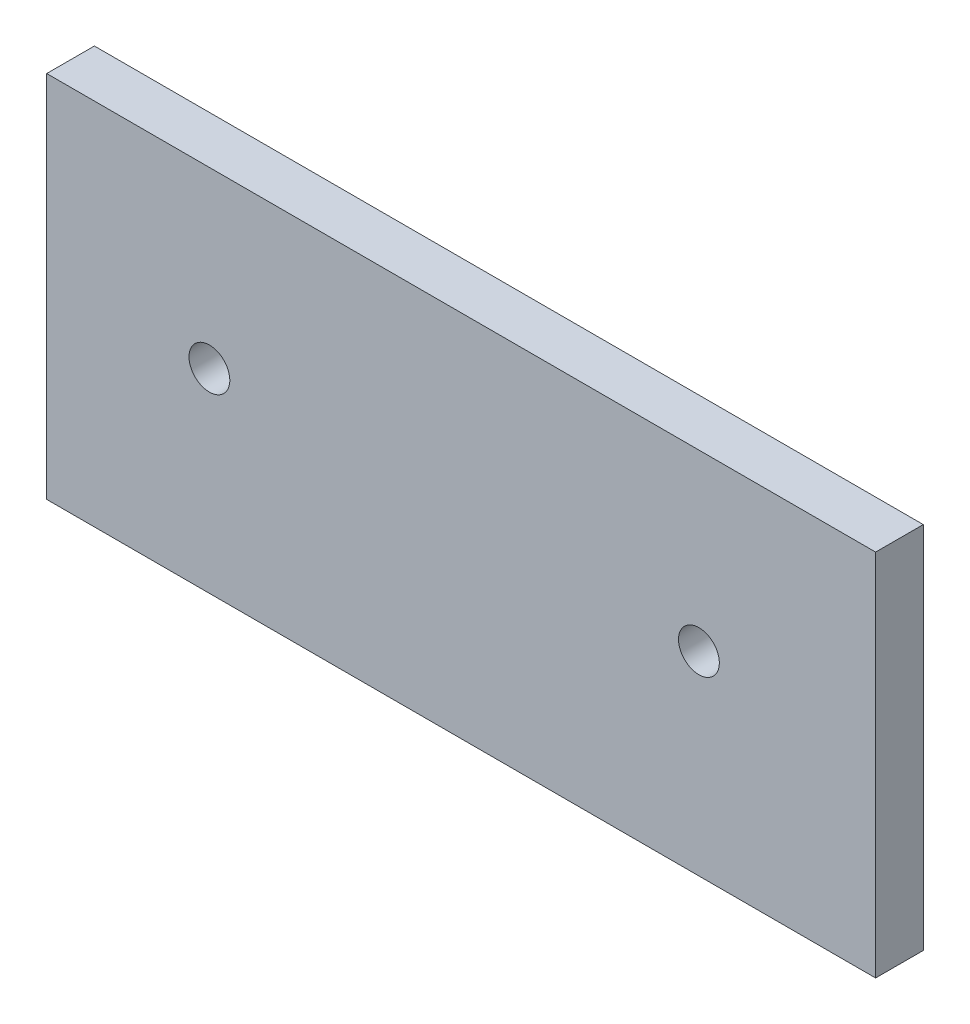
ISO-10303-21;
HEADER;
FILE_DESCRIPTION(('STEP AP214'),'2;1');
FILE_NAME('part.step','',(''),(''),'','','');
FILE_SCHEMA(('AUTOMOTIVE_DESIGN { 1 0 10303 214 1 1 1 1 }'));
ENDSEC;
DATA;
#1=APPLICATION_CONTEXT('core data for automotive mechanical design processes');
#2=APPLICATION_PROTOCOL_DEFINITION('international standard','automotive_design',2000,#1);
#3=PRODUCT_CONTEXT('',#1,'mechanical');
#4=PRODUCT('Part','Part','',(#3));
#5=PRODUCT_RELATED_PRODUCT_CATEGORY('part','',(#4));
#6=PRODUCT_DEFINITION_FORMATION('','',#4);
#7=PRODUCT_DEFINITION_CONTEXT('part definition',#1,'design');
#8=PRODUCT_DEFINITION('design','',#6,#7);
#9=PRODUCT_DEFINITION_SHAPE('','',#8);
#10=(LENGTH_UNIT() NAMED_UNIT(*) SI_UNIT(.MILLI.,.METRE.));
#11=(NAMED_UNIT(*) PLANE_ANGLE_UNIT() SI_UNIT($,.RADIAN.));
#12=(NAMED_UNIT(*) SI_UNIT($,.STERADIAN.) SOLID_ANGLE_UNIT());
#13=UNCERTAINTY_MEASURE_WITH_UNIT(LENGTH_MEASURE(1.E-05),#10,'distance_accuracy_value','');
#14=(GEOMETRIC_REPRESENTATION_CONTEXT(3) GLOBAL_UNCERTAINTY_ASSIGNED_CONTEXT((#13)) GLOBAL_UNIT_ASSIGNED_CONTEXT((#10,
#11,#12)) REPRESENTATION_CONTEXT('',''));
#15=CARTESIAN_POINT('',(0.,0.,0.));
#16=DIRECTION('',(0.,0.,1.));
#17=DIRECTION('',(1.,0.,0.));
#18=AXIS2_PLACEMENT_3D('',#15,#16,#17);
#19=CARTESIAN_POINT('',(-101.6,0.,5.842));
#20=DIRECTION('',(1.,0.,0.));
#21=DIRECTION('',(0.,0.,-1.));
#22=AXIS2_PLACEMENT_3D('',#19,#20,#21);
#23=PLANE('',#22);
#24=DIRECTION('',(0.,-1.,0.));
#25=VECTOR('',#24,1.);
#26=CARTESIAN_POINT('',(-101.6,0.,0.));
#27=LINE('',#26,#25);
#28=CARTESIAN_POINT('',(-101.6,45.212,0.));
#29=VERTEX_POINT('',#28);
#30=CARTESIAN_POINT('',(-101.6,0.,0.));
#31=VERTEX_POINT('',#30);
#32=EDGE_CURVE('E96',#29,#31,#27,.T.);
#33=ORIENTED_EDGE('',*,*,#32,.T.);
#34=DIRECTION('',(0.,0.,-1.));
#35=VECTOR('',#34,1.);
#36=CARTESIAN_POINT('',(-101.6,0.,5.842));
#37=LINE('',#36,#35);
#38=CARTESIAN_POINT('',(-101.6,0.,5.842));
#39=VERTEX_POINT('',#38);
#40=EDGE_CURVE('E11',#39,#31,#37,.T.);
#41=ORIENTED_EDGE('',*,*,#40,.F.);
#42=DIRECTION('',(0.,-1.,0.));
#43=VECTOR('',#42,1.);
#44=CARTESIAN_POINT('',(-101.6,0.,5.842));
#45=LINE('',#44,#43);
#46=CARTESIAN_POINT('',(-101.6,45.212,5.842));
#47=VERTEX_POINT('',#46);
#48=EDGE_CURVE('E84',#47,#39,#45,.T.);
#49=ORIENTED_EDGE('',*,*,#48,.F.);
#50=DIRECTION('',(0.,0.,-1.));
#51=VECTOR('',#50,1.);
#52=CARTESIAN_POINT('',(-101.6,45.212,5.842));
#53=LINE('',#52,#51);
#54=EDGE_CURVE('E92',#47,#29,#53,.T.);
#55=ORIENTED_EDGE('',*,*,#54,.T.);
#56=EDGE_LOOP('',(#33,#41,#49,#55));
#57=FACE_BOUND('',#56,.T.);
#58=ADVANCED_FACE('F33',(#57),#23,.F.);
#59=CARTESIAN_POINT('',(-101.6,0.,5.842));
#60=DIRECTION('',(0.,1.,0.));
#61=DIRECTION('',(0.,0.,1.));
#62=AXIS2_PLACEMENT_3D('',#59,#60,#61);
#63=PLANE('',#62);
#64=DIRECTION('',(1.,0.,0.));
#65=VECTOR('',#64,1.);
#66=CARTESIAN_POINT('',(-101.6,0.,0.));
#67=LINE('',#66,#65);
#68=CARTESIAN_POINT('',(0.,0.,0.));
#69=VERTEX_POINT('',#68);
#70=EDGE_CURVE('E88',#31,#69,#67,.T.);
#71=ORIENTED_EDGE('',*,*,#70,.T.);
#72=DIRECTION('',(0.,0.,-1.));
#73=VECTOR('',#72,1.);
#74=CARTESIAN_POINT('',(0.,0.,5.842));
#75=LINE('',#74,#73);
#76=CARTESIAN_POINT('',(0.,0.,5.842));
#77=VERTEX_POINT('',#76);
#78=EDGE_CURVE('E41',#77,#69,#75,.T.);
#79=ORIENTED_EDGE('',*,*,#78,.F.);
#80=DIRECTION('',(1.,0.,0.));
#81=VECTOR('',#80,1.);
#82=CARTESIAN_POINT('',(-101.6,0.,5.842));
#83=LINE('',#82,#81);
#84=EDGE_CURVE('E79',#39,#77,#83,.T.);
#85=ORIENTED_EDGE('',*,*,#84,.F.);
#86=ORIENTED_EDGE('',*,*,#40,.T.);
#87=EDGE_LOOP('',(#71,#79,#85,#86));
#88=FACE_BOUND('',#87,.T.);
#89=ADVANCED_FACE('F87',(#88),#63,.F.);
#90=CARTESIAN_POINT('',(0.,0.,5.842));
#91=DIRECTION('',(-1.,0.,0.));
#92=DIRECTION('',(0.,0.,1.));
#93=AXIS2_PLACEMENT_3D('',#90,#91,#92);
#94=PLANE('',#93);
#95=DIRECTION('',(0.,1.,0.));
#96=VECTOR('',#95,1.);
#97=CARTESIAN_POINT('',(0.,0.,0.));
#98=LINE('',#97,#96);
#99=CARTESIAN_POINT('',(0.,45.212,0.));
#100=VERTEX_POINT('',#99);
#101=EDGE_CURVE('E66',#69,#100,#98,.T.);
#102=ORIENTED_EDGE('',*,*,#101,.T.);
#103=DIRECTION('',(0.,0.,-1.));
#104=VECTOR('',#103,1.);
#105=CARTESIAN_POINT('',(0.,45.212,5.842));
#106=LINE('',#105,#104);
#107=CARTESIAN_POINT('',(0.,45.212,5.842));
#108=VERTEX_POINT('',#107);
#109=EDGE_CURVE('E89',#108,#100,#106,.T.);
#110=ORIENTED_EDGE('',*,*,#109,.F.);
#111=DIRECTION('',(0.,1.,0.));
#112=VECTOR('',#111,1.);
#113=CARTESIAN_POINT('',(0.,0.,5.842));
#114=LINE('',#113,#112);
#115=EDGE_CURVE('E82',#77,#108,#114,.T.);
#116=ORIENTED_EDGE('',*,*,#115,.F.);
#117=ORIENTED_EDGE('',*,*,#78,.T.);
#118=EDGE_LOOP('',(#102,#110,#116,#117));
#119=FACE_BOUND('',#118,.T.);
#120=ADVANCED_FACE('F90',(#119),#94,.F.);
#121=CARTESIAN_POINT('',(-101.6,45.212,5.842));
#122=DIRECTION('',(0.,-1.,0.));
#123=DIRECTION('',(0.,0.,-1.));
#124=AXIS2_PLACEMENT_3D('',#121,#122,#123);
#125=PLANE('',#124);
#126=DIRECTION('',(-1.,0.,0.));
#127=VECTOR('',#126,1.);
#128=CARTESIAN_POINT('',(-101.6,45.212,0.));
#129=LINE('',#128,#127);
#130=EDGE_CURVE('E72',#100,#29,#129,.T.);
#131=ORIENTED_EDGE('',*,*,#130,.T.);
#132=ORIENTED_EDGE('',*,*,#54,.F.);
#133=DIRECTION('',(-1.,0.,0.));
#134=VECTOR('',#133,1.);
#135=CARTESIAN_POINT('',(-101.6,45.212,5.842));
#136=LINE('',#135,#134);
#137=EDGE_CURVE('E49',#108,#47,#136,.T.);
#138=ORIENTED_EDGE('',*,*,#137,.F.);
#139=ORIENTED_EDGE('',*,*,#109,.T.);
#140=EDGE_LOOP('',(#131,#132,#138,#139));
#141=FACE_BOUND('',#140,.T.);
#142=ADVANCED_FACE('F104',(#141),#125,.F.);
#143=CARTESIAN_POINT('',(0.,0.,5.842));
#144=DIRECTION('',(0.,0.,-1.));
#145=DIRECTION('',(-1.,0.,0.));
#146=AXIS2_PLACEMENT_3D('',#143,#144,#145);
#147=PLANE('',#146);
#148=CARTESIAN_POINT('',(-21.6569926395346,23.8648844244175,5.842));
#149=DIRECTION('',(0.,0.,-1.));
#150=DIRECTION('',(-1.,0.,0.));
#151=AXIS2_PLACEMENT_3D('',#148,#149,#150);
#152=CIRCLE('',#151,2.49999999999999);
#153=CARTESIAN_POINT('',(-24.1569926395346,23.8648844244175,5.842));
#154=VERTEX_POINT('',#153);
#155=EDGE_CURVE('E115',#154,#154,#152,.T.);
#156=ORIENTED_EDGE('',*,*,#155,.T.);
#157=EDGE_LOOP('',(#156));
#158=FACE_BOUND('',#157,.T.);
#159=CARTESIAN_POINT('',(-81.6598930743401,23.8648844244175,5.842));
#160=DIRECTION('',(0.,0.,-1.));
#161=DIRECTION('',(-1.,0.,0.));
#162=AXIS2_PLACEMENT_3D('',#159,#160,#161);
#163=CIRCLE('',#162,2.49999999999999);
#164=CARTESIAN_POINT('',(-84.1598930743401,23.8648844244175,5.842));
#165=VERTEX_POINT('',#164);
#166=EDGE_CURVE('E99',#165,#165,#163,.T.);
#167=ORIENTED_EDGE('',*,*,#166,.T.);
#168=EDGE_LOOP('',(#167));
#169=FACE_BOUND('',#168,.T.);
#170=ORIENTED_EDGE('',*,*,#48,.T.);
#171=ORIENTED_EDGE('',*,*,#84,.T.);
#172=ORIENTED_EDGE('',*,*,#115,.T.);
#173=ORIENTED_EDGE('',*,*,#137,.T.);
#174=EDGE_LOOP('',(#170,#171,#172,#173));
#175=FACE_BOUND('',#174,.T.);
#176=ADVANCED_FACE('F80',(#158,#169,#175),#147,.F.);
#177=CARTESIAN_POINT('',(0.,0.,0.));
#178=DIRECTION('',(0.,0.,-1.));
#179=DIRECTION('',(-1.,0.,0.));
#180=AXIS2_PLACEMENT_3D('',#177,#178,#179);
#181=PLANE('',#180);
#182=CARTESIAN_POINT('',(-21.6569926395346,23.8648844244175,0.));
#183=DIRECTION('',(0.,0.,-1.));
#184=DIRECTION('',(-1.,0.,0.));
#185=AXIS2_PLACEMENT_3D('',#182,#183,#184);
#186=CIRCLE('',#185,2.49999999999999);
#187=CARTESIAN_POINT('',(-24.1569926395346,23.8648844244175,0.));
#188=VERTEX_POINT('',#187);
#189=EDGE_CURVE('E118',#188,#188,#186,.T.);
#190=ORIENTED_EDGE('',*,*,#189,.F.);
#191=EDGE_LOOP('',(#190));
#192=FACE_BOUND('',#191,.T.);
#193=CARTESIAN_POINT('',(-81.6598930743401,23.8648844244175,0.));
#194=DIRECTION('',(0.,0.,-1.));
#195=DIRECTION('',(-1.,0.,0.));
#196=AXIS2_PLACEMENT_3D('',#193,#194,#195);
#197=CIRCLE('',#196,2.49999999999999);
#198=CARTESIAN_POINT('',(-84.1598930743401,23.8648844244175,0.));
#199=VERTEX_POINT('',#198);
#200=EDGE_CURVE('E112',#199,#199,#197,.T.);
#201=ORIENTED_EDGE('',*,*,#200,.F.);
#202=EDGE_LOOP('',(#201));
#203=FACE_BOUND('',#202,.T.);
#204=ORIENTED_EDGE('',*,*,#32,.F.);
#205=ORIENTED_EDGE('',*,*,#130,.F.);
#206=ORIENTED_EDGE('',*,*,#101,.F.);
#207=ORIENTED_EDGE('',*,*,#70,.F.);
#208=EDGE_LOOP('',(#204,#205,#206,#207));
#209=FACE_BOUND('',#208,.T.);
#210=ADVANCED_FACE('F107',(#192,#203,#209),#181,.T.);
#211=CARTESIAN_POINT('',(-81.6598930743401,23.8648844244175,0.));
#212=DIRECTION('',(0.,0.,-1.));
#213=DIRECTION('',(-1.,0.,0.));
#214=AXIS2_PLACEMENT_3D('',#211,#212,#213);
#215=CYLINDRICAL_SURFACE('',#214,2.49999999999999);
#216=ORIENTED_EDGE('',*,*,#200,.T.);
#217=EDGE_LOOP('',(#216));
#218=FACE_BOUND('',#217,.T.);
#219=ORIENTED_EDGE('',*,*,#166,.F.);
#220=EDGE_LOOP('',(#219));
#221=FACE_BOUND('',#220,.T.);
#222=ADVANCED_FACE('F127',(#218,#221),#215,.F.);
#223=CARTESIAN_POINT('',(-21.6569926395346,23.8648844244175,0.));
#224=DIRECTION('',(0.,0.,-1.));
#225=DIRECTION('',(-1.,0.,0.));
#226=AXIS2_PLACEMENT_3D('',#223,#224,#225);
#227=CYLINDRICAL_SURFACE('',#226,2.49999999999999);
#228=ORIENTED_EDGE('',*,*,#189,.T.);
#229=EDGE_LOOP('',(#228));
#230=FACE_BOUND('',#229,.T.);
#231=ORIENTED_EDGE('',*,*,#155,.F.);
#232=EDGE_LOOP('',(#231));
#233=FACE_BOUND('',#232,.T.);
#234=ADVANCED_FACE('F122',(#230,#233),#227,.F.);
#235=CLOSED_SHELL('',(#58,#89,#120,#142,#176,#210,#222,#234));
#236=MANIFOLD_SOLID_BREP('B2',#235);
#237=ADVANCED_BREP_SHAPE_REPRESENTATION('',(#18,#236),#14);
#238=SHAPE_DEFINITION_REPRESENTATION(#9,#237);
ENDSEC;
END-ISO-10303-21;
